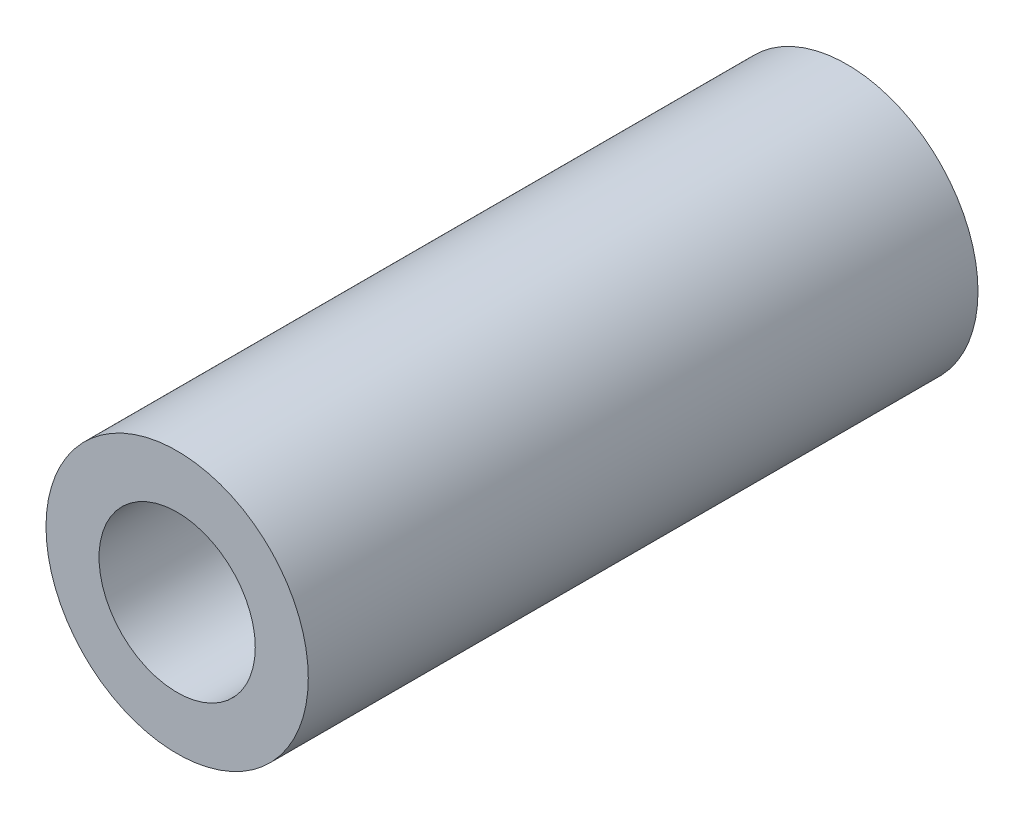
ISO-10303-21;
HEADER;
FILE_DESCRIPTION(('STEP AP214'),'2;1');
FILE_NAME('part.step','',(''),(''),'','','');
FILE_SCHEMA(('AUTOMOTIVE_DESIGN { 1 0 10303 214 1 1 1 1 }'));
ENDSEC;
DATA;
#1=APPLICATION_CONTEXT('core data for automotive mechanical design processes');
#2=APPLICATION_PROTOCOL_DEFINITION('international standard','automotive_design',2000,#1);
#3=PRODUCT_CONTEXT('',#1,'mechanical');
#4=PRODUCT('Part','Part','',(#3));
#5=PRODUCT_RELATED_PRODUCT_CATEGORY('part','',(#4));
#6=PRODUCT_DEFINITION_FORMATION('','',#4);
#7=PRODUCT_DEFINITION_CONTEXT('part definition',#1,'design');
#8=PRODUCT_DEFINITION('design','',#6,#7);
#9=PRODUCT_DEFINITION_SHAPE('','',#8);
#10=(LENGTH_UNIT() NAMED_UNIT(*) SI_UNIT(.MILLI.,.METRE.));
#11=(NAMED_UNIT(*) PLANE_ANGLE_UNIT() SI_UNIT($,.RADIAN.));
#12=(NAMED_UNIT(*) SI_UNIT($,.STERADIAN.) SOLID_ANGLE_UNIT());
#13=UNCERTAINTY_MEASURE_WITH_UNIT(LENGTH_MEASURE(1.E-05),#10,'distance_accuracy_value','');
#14=(GEOMETRIC_REPRESENTATION_CONTEXT(3) GLOBAL_UNCERTAINTY_ASSIGNED_CONTEXT((#13)) GLOBAL_UNIT_ASSIGNED_CONTEXT((#10,
#11,#12)) REPRESENTATION_CONTEXT('',''));
#15=CARTESIAN_POINT('',(0.,0.,0.));
#16=DIRECTION('',(0.,0.,1.));
#17=DIRECTION('',(1.,0.,0.));
#18=AXIS2_PLACEMENT_3D('',#15,#16,#17);
#19=CARTESIAN_POINT('',(0.,0.,30.));
#20=DIRECTION('',(0.,0.,1.));
#21=DIRECTION('',(1.,0.,0.));
#22=AXIS2_PLACEMENT_3D('',#19,#20,#21);
#23=PLANE('',#22);
#24=CARTESIAN_POINT('',(0.,0.,30.));
#25=DIRECTION('',(0.,0.,1.));
#26=DIRECTION('',(1.,0.,0.));
#27=AXIS2_PLACEMENT_3D('',#24,#25,#26);
#28=CIRCLE('',#27,11.75);
#29=CARTESIAN_POINT('',(11.75,0.,30.));
#30=VERTEX_POINT('',#29);
#31=EDGE_CURVE('E10',#30,#30,#28,.T.);
#32=ORIENTED_EDGE('',*,*,#31,.T.);
#33=EDGE_LOOP('',(#32));
#34=FACE_BOUND('',#33,.T.);
#35=CARTESIAN_POINT('',(0.,0.,30.));
#36=DIRECTION('',(0.,0.,1.));
#37=DIRECTION('',(1.,0.,0.));
#38=AXIS2_PLACEMENT_3D('',#35,#36,#37);
#39=CIRCLE('',#38,7.);
#40=CARTESIAN_POINT('',(7.,0.,30.));
#41=VERTEX_POINT('',#40);
#42=EDGE_CURVE('E49',#41,#41,#39,.T.);
#43=ORIENTED_EDGE('',*,*,#42,.F.);
#44=EDGE_LOOP('',(#43));
#45=FACE_BOUND('',#44,.T.);
#46=ADVANCED_FACE('F39',(#34,#45),#23,.T.);
#47=CARTESIAN_POINT('',(0.,0.,-30.));
#48=DIRECTION('',(0.,0.,1.));
#49=DIRECTION('',(1.,0.,0.));
#50=AXIS2_PLACEMENT_3D('',#47,#48,#49);
#51=PLANE('',#50);
#52=CARTESIAN_POINT('',(0.,0.,-30.));
#53=DIRECTION('',(0.,0.,1.));
#54=DIRECTION('',(1.,0.,0.));
#55=AXIS2_PLACEMENT_3D('',#52,#53,#54);
#56=CIRCLE('',#55,11.75);
#57=CARTESIAN_POINT('',(11.75,0.,-30.));
#58=VERTEX_POINT('',#57);
#59=EDGE_CURVE('E43',#58,#58,#56,.T.);
#60=ORIENTED_EDGE('',*,*,#59,.F.);
#61=EDGE_LOOP('',(#60));
#62=FACE_BOUND('',#61,.T.);
#63=CARTESIAN_POINT('',(0.,0.,-30.));
#64=DIRECTION('',(0.,0.,1.));
#65=DIRECTION('',(1.,0.,0.));
#66=AXIS2_PLACEMENT_3D('',#63,#64,#65);
#67=CIRCLE('',#66,7.);
#68=CARTESIAN_POINT('',(7.,0.,-30.));
#69=VERTEX_POINT('',#68);
#70=EDGE_CURVE('E55',#69,#69,#67,.T.);
#71=ORIENTED_EDGE('',*,*,#70,.T.);
#72=EDGE_LOOP('',(#71));
#73=FACE_BOUND('',#72,.T.);
#74=ADVANCED_FACE('F65',(#62,#73),#51,.F.);
#75=CARTESIAN_POINT('',(0.,0.,30.));
#76=DIRECTION('',(0.,0.,-1.));
#77=DIRECTION('',(-1.,0.,0.));
#78=AXIS2_PLACEMENT_3D('',#75,#76,#77);
#79=CYLINDRICAL_SURFACE('',#78,11.75);
#80=ORIENTED_EDGE('',*,*,#31,.F.);
#81=EDGE_LOOP('',(#80));
#82=FACE_BOUND('',#81,.T.);
#83=ORIENTED_EDGE('',*,*,#59,.T.);
#84=EDGE_LOOP('',(#83));
#85=FACE_BOUND('',#84,.T.);
#86=ADVANCED_FACE('F41',(#82,#85),#79,.T.);
#87=CARTESIAN_POINT('',(0.,0.,30.));
#88=DIRECTION('',(0.,0.,-1.));
#89=DIRECTION('',(-1.,0.,0.));
#90=AXIS2_PLACEMENT_3D('',#87,#88,#89);
#91=CYLINDRICAL_SURFACE('',#90,7.);
#92=ORIENTED_EDGE('',*,*,#42,.T.);
#93=EDGE_LOOP('',(#92));
#94=FACE_BOUND('',#93,.T.);
#95=ORIENTED_EDGE('',*,*,#70,.F.);
#96=EDGE_LOOP('',(#95));
#97=FACE_BOUND('',#96,.T.);
#98=ADVANCED_FACE('F59',(#94,#97),#91,.F.);
#99=CLOSED_SHELL('',(#46,#74,#86,#98));
#100=MANIFOLD_SOLID_BREP('B2',#99);
#101=ADVANCED_BREP_SHAPE_REPRESENTATION('',(#18,#100),#14);
#102=SHAPE_DEFINITION_REPRESENTATION(#9,#101);
ENDSEC;
END-ISO-10303-21;
